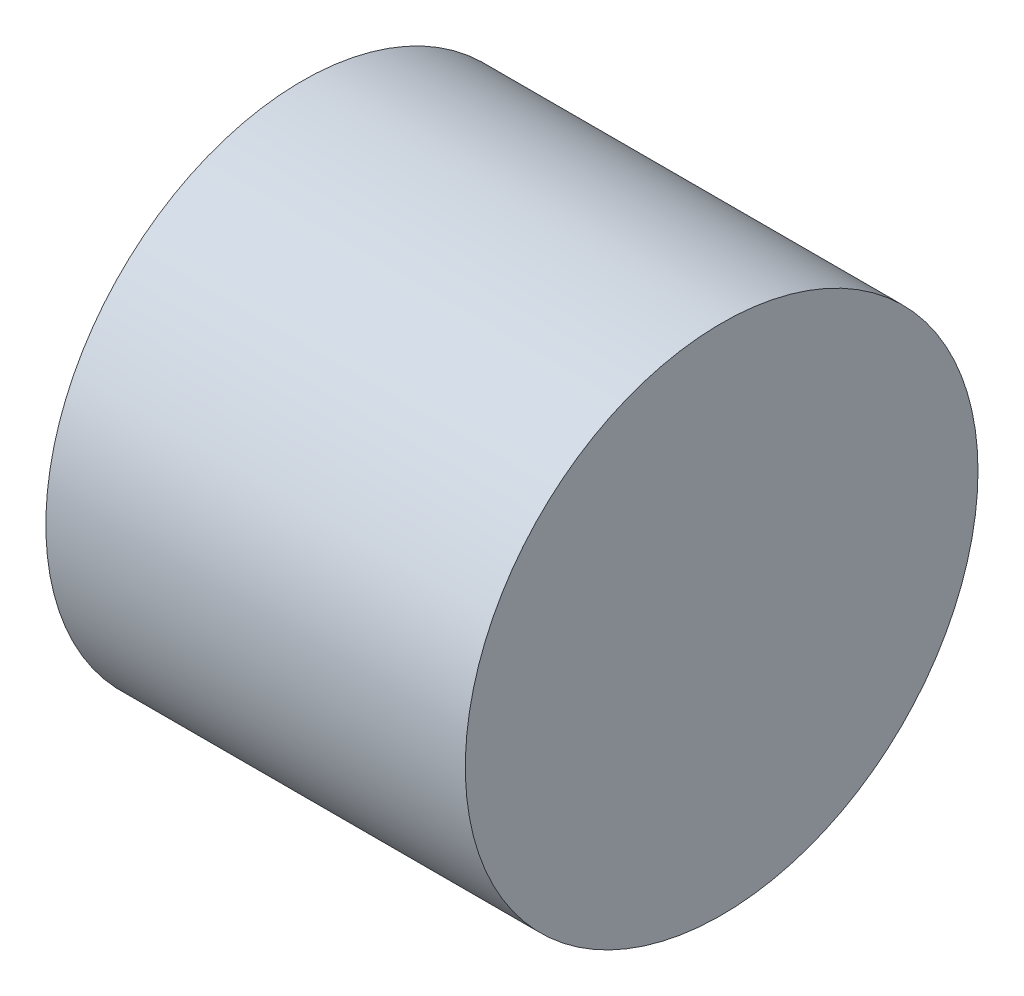
ISO-10303-21;
HEADER;
FILE_DESCRIPTION(('STEP AP214'),'2;1');
FILE_NAME('part.step','',(''),(''),'','','');
FILE_SCHEMA(('AUTOMOTIVE_DESIGN { 1 0 10303 214 1 1 1 1 }'));
ENDSEC;
DATA;
#1=APPLICATION_CONTEXT('core data for automotive mechanical design processes');
#2=APPLICATION_PROTOCOL_DEFINITION('international standard','automotive_design',2000,#1);
#3=PRODUCT_CONTEXT('',#1,'mechanical');
#4=PRODUCT('Part','Part','',(#3));
#5=PRODUCT_RELATED_PRODUCT_CATEGORY('part','',(#4));
#6=PRODUCT_DEFINITION_FORMATION('','',#4);
#7=PRODUCT_DEFINITION_CONTEXT('part definition',#1,'design');
#8=PRODUCT_DEFINITION('design','',#6,#7);
#9=PRODUCT_DEFINITION_SHAPE('','',#8);
#10=(LENGTH_UNIT() NAMED_UNIT(*) SI_UNIT(.MILLI.,.METRE.));
#11=(NAMED_UNIT(*) PLANE_ANGLE_UNIT() SI_UNIT($,.RADIAN.));
#12=(NAMED_UNIT(*) SI_UNIT($,.STERADIAN.) SOLID_ANGLE_UNIT());
#13=UNCERTAINTY_MEASURE_WITH_UNIT(LENGTH_MEASURE(1.E-05),#10,'distance_accuracy_value','');
#14=(GEOMETRIC_REPRESENTATION_CONTEXT(3) GLOBAL_UNCERTAINTY_ASSIGNED_CONTEXT((#13)) GLOBAL_UNIT_ASSIGNED_CONTEXT((#10,
#11,#12)) REPRESENTATION_CONTEXT('',''));
#15=CARTESIAN_POINT('',(0.,0.,0.));
#16=DIRECTION('',(0.,0.,1.));
#17=DIRECTION('',(1.,0.,0.));
#18=AXIS2_PLACEMENT_3D('',#15,#16,#17);
#19=CARTESIAN_POINT('',(450.,0.,0.));
#20=DIRECTION('',(-1.,0.,0.));
#21=DIRECTION('',(0.,0.,1.));
#22=AXIS2_PLACEMENT_3D('',#19,#20,#21);
#23=CYLINDRICAL_SURFACE('',#22,275.);
#24=CARTESIAN_POINT('',(450.,0.,0.));
#25=DIRECTION('',(1.,0.,0.));
#26=DIRECTION('',(0.,0.,-1.));
#27=AXIS2_PLACEMENT_3D('',#24,#25,#26);
#28=CIRCLE('',#27,275.);
#29=CARTESIAN_POINT('',(450.,0.,-275.));
#30=VERTEX_POINT('',#29);
#31=EDGE_CURVE('E10',#30,#30,#28,.T.);
#32=ORIENTED_EDGE('',*,*,#31,.F.);
#33=EDGE_LOOP('',(#32));
#34=FACE_BOUND('',#33,.T.);
#35=CARTESIAN_POINT('',(0.,0.,0.));
#36=DIRECTION('',(1.,0.,0.));
#37=DIRECTION('',(0.,0.,-1.));
#38=AXIS2_PLACEMENT_3D('',#35,#36,#37);
#39=CIRCLE('',#38,275.);
#40=CARTESIAN_POINT('',(0.,0.,-275.));
#41=VERTEX_POINT('',#40);
#42=EDGE_CURVE('E36',#41,#41,#39,.T.);
#43=ORIENTED_EDGE('',*,*,#42,.T.);
#44=EDGE_LOOP('',(#43));
#45=FACE_BOUND('',#44,.T.);
#46=ADVANCED_FACE('F33',(#34,#45),#23,.T.);
#47=CARTESIAN_POINT('',(450.,0.,0.));
#48=DIRECTION('',(1.,0.,0.));
#49=DIRECTION('',(0.,0.,-1.));
#50=AXIS2_PLACEMENT_3D('',#47,#48,#49);
#51=PLANE('',#50);
#52=ORIENTED_EDGE('',*,*,#31,.T.);
#53=EDGE_LOOP('',(#52));
#54=FACE_BOUND('',#53,.T.);
#55=ADVANCED_FACE('F48',(#54),#51,.T.);
#56=CARTESIAN_POINT('',(0.,0.,0.));
#57=DIRECTION('',(1.,0.,0.));
#58=DIRECTION('',(0.,0.,-1.));
#59=AXIS2_PLACEMENT_3D('',#56,#57,#58);
#60=PLANE('',#59);
#61=ORIENTED_EDGE('',*,*,#42,.F.);
#62=EDGE_LOOP('',(#61));
#63=FACE_BOUND('',#62,.T.);
#64=ADVANCED_FACE('F46',(#63),#60,.F.);
#65=CLOSED_SHELL('',(#46,#55,#64));
#66=MANIFOLD_SOLID_BREP('B2',#65);
#67=ADVANCED_BREP_SHAPE_REPRESENTATION('',(#18,#66),#14);
#68=SHAPE_DEFINITION_REPRESENTATION(#9,#67);
ENDSEC;
END-ISO-10303-21;
